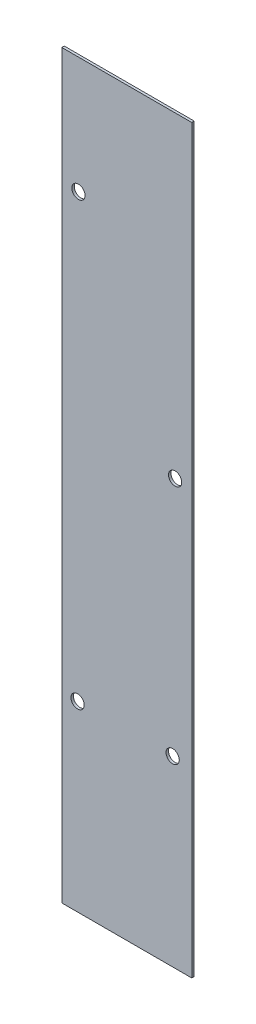
ISO-10303-21;
HEADER;
FILE_DESCRIPTION(('STEP AP214'),'2;1');
FILE_NAME('part.step','',(''),(''),'','','');
FILE_SCHEMA(('AUTOMOTIVE_DESIGN { 1 0 10303 214 1 1 1 1 }'));
ENDSEC;
DATA;
#1=APPLICATION_CONTEXT('core data for automotive mechanical design processes');
#2=APPLICATION_PROTOCOL_DEFINITION('international standard','automotive_design',2000,#1);
#3=PRODUCT_CONTEXT('',#1,'mechanical');
#4=PRODUCT('Part','Part','',(#3));
#5=PRODUCT_RELATED_PRODUCT_CATEGORY('part','',(#4));
#6=PRODUCT_DEFINITION_FORMATION('','',#4);
#7=PRODUCT_DEFINITION_CONTEXT('part definition',#1,'design');
#8=PRODUCT_DEFINITION('design','',#6,#7);
#9=PRODUCT_DEFINITION_SHAPE('','',#8);
#10=(LENGTH_UNIT() NAMED_UNIT(*) SI_UNIT(.MILLI.,.METRE.));
#11=(NAMED_UNIT(*) PLANE_ANGLE_UNIT() SI_UNIT($,.RADIAN.));
#12=(NAMED_UNIT(*) SI_UNIT($,.STERADIAN.) SOLID_ANGLE_UNIT());
#13=UNCERTAINTY_MEASURE_WITH_UNIT(LENGTH_MEASURE(1.E-05),#10,'distance_accuracy_value','');
#14=(GEOMETRIC_REPRESENTATION_CONTEXT(3) GLOBAL_UNCERTAINTY_ASSIGNED_CONTEXT((#13)) GLOBAL_UNIT_ASSIGNED_CONTEXT((#10,
#11,#12)) REPRESENTATION_CONTEXT('',''));
#15=CARTESIAN_POINT('',(0.,0.,0.));
#16=DIRECTION('',(0.,0.,1.));
#17=DIRECTION('',(1.,0.,0.));
#18=AXIS2_PLACEMENT_3D('',#15,#16,#17);
#19=CARTESIAN_POINT('',(0.,222.25,-0.736599999999997));
#20=DIRECTION('',(-1.,0.,0.));
#21=DIRECTION('',(0.,-1.,0.));
#22=AXIS2_PLACEMENT_3D('',#19,#20,#21);
#23=PLANE('',#22);
#24=DIRECTION('',(0.,-1.,0.));
#25=VECTOR('',#24,1.);
#26=CARTESIAN_POINT('',(0.,222.25,0.));
#27=LINE('',#26,#25);
#28=CARTESIAN_POINT('',(0.,222.25,0.));
#29=VERTEX_POINT('',#28);
#30=CARTESIAN_POINT('',(0.,0.,0.));
#31=VERTEX_POINT('',#30);
#32=EDGE_CURVE('E103',#29,#31,#27,.T.);
#33=ORIENTED_EDGE('',*,*,#32,.F.);
#34=DIRECTION('',(0.,0.,1.));
#35=VECTOR('',#34,1.);
#36=CARTESIAN_POINT('',(0.,222.25,-0.736599999999997));
#37=LINE('',#36,#35);
#38=CARTESIAN_POINT('',(0.,222.25,-0.736599999999997));
#39=VERTEX_POINT('',#38);
#40=EDGE_CURVE('E11',#39,#29,#37,.T.);
#41=ORIENTED_EDGE('',*,*,#40,.F.);
#42=DIRECTION('',(0.,-1.,0.));
#43=VECTOR('',#42,1.);
#44=CARTESIAN_POINT('',(0.,222.25,-0.736599999999997));
#45=LINE('',#44,#43);
#46=CARTESIAN_POINT('',(0.,0.,-0.736599999999997));
#47=VERTEX_POINT('',#46);
#48=EDGE_CURVE('E96',#39,#47,#45,.T.);
#49=ORIENTED_EDGE('',*,*,#48,.T.);
#50=DIRECTION('',(0.,0.,1.));
#51=VECTOR('',#50,1.);
#52=CARTESIAN_POINT('',(0.,0.,-0.736599999999997));
#53=LINE('',#52,#51);
#54=EDGE_CURVE('E41',#47,#31,#53,.T.);
#55=ORIENTED_EDGE('',*,*,#54,.T.);
#56=EDGE_LOOP('',(#33,#41,#49,#55));
#57=FACE_BOUND('',#56,.T.);
#58=ADVANCED_FACE('F38',(#57),#23,.T.);
#59=CARTESIAN_POINT('',(0.,222.25,-0.736599999999997));
#60=DIRECTION('',(0.,1.,0.));
#61=DIRECTION('',(0.,0.,1.));
#62=AXIS2_PLACEMENT_3D('',#59,#60,#61);
#63=PLANE('',#62);
#64=DIRECTION('',(-1.,0.,0.));
#65=VECTOR('',#64,1.);
#66=CARTESIAN_POINT('',(0.,222.25,0.));
#67=LINE('',#66,#65);
#68=CARTESIAN_POINT('',(39.,222.25,0.));
#69=VERTEX_POINT('',#68);
#70=EDGE_CURVE('E98',#69,#29,#67,.T.);
#71=ORIENTED_EDGE('',*,*,#70,.F.);
#72=DIRECTION('',(0.,0.,1.));
#73=VECTOR('',#72,1.);
#74=CARTESIAN_POINT('',(39.,222.25,-0.736599999999997));
#75=LINE('',#74,#73);
#76=CARTESIAN_POINT('',(39.,222.25,-0.736599999999997));
#77=VERTEX_POINT('',#76);
#78=EDGE_CURVE('E47',#77,#69,#75,.T.);
#79=ORIENTED_EDGE('',*,*,#78,.F.);
#80=DIRECTION('',(-1.,0.,0.));
#81=VECTOR('',#80,1.);
#82=CARTESIAN_POINT('',(0.,222.25,-0.736599999999997));
#83=LINE('',#82,#81);
#84=EDGE_CURVE('E93',#77,#39,#83,.T.);
#85=ORIENTED_EDGE('',*,*,#84,.T.);
#86=ORIENTED_EDGE('',*,*,#40,.T.);
#87=EDGE_LOOP('',(#71,#79,#85,#86));
#88=FACE_BOUND('',#87,.T.);
#89=ADVANCED_FACE('F114',(#88),#63,.T.);
#90=CARTESIAN_POINT('',(39.,222.25,-0.736599999999997));
#91=DIRECTION('',(1.,0.,0.));
#92=DIRECTION('',(0.,1.,0.));
#93=AXIS2_PLACEMENT_3D('',#90,#91,#92);
#94=PLANE('',#93);
#95=DIRECTION('',(0.,1.,0.));
#96=VECTOR('',#95,1.);
#97=CARTESIAN_POINT('',(39.,222.25,0.));
#98=LINE('',#97,#96);
#99=CARTESIAN_POINT('',(39.,0.,0.));
#100=VERTEX_POINT('',#99);
#101=EDGE_CURVE('E88',#100,#69,#98,.T.);
#102=ORIENTED_EDGE('',*,*,#101,.F.);
#103=DIRECTION('',(0.,0.,1.));
#104=VECTOR('',#103,1.);
#105=CARTESIAN_POINT('',(39.,0.,-0.736599999999997));
#106=LINE('',#105,#104);
#107=CARTESIAN_POINT('',(39.,0.,-0.736599999999997));
#108=VERTEX_POINT('',#107);
#109=EDGE_CURVE('E83',#108,#100,#106,.T.);
#110=ORIENTED_EDGE('',*,*,#109,.F.);
#111=DIRECTION('',(0.,1.,0.));
#112=VECTOR('',#111,1.);
#113=CARTESIAN_POINT('',(39.,222.25,-0.736599999999997));
#114=LINE('',#113,#112);
#115=EDGE_CURVE('E86',#108,#77,#114,.T.);
#116=ORIENTED_EDGE('',*,*,#115,.T.);
#117=ORIENTED_EDGE('',*,*,#78,.T.);
#118=EDGE_LOOP('',(#102,#110,#116,#117));
#119=FACE_BOUND('',#118,.T.);
#120=ADVANCED_FACE('F85',(#119),#94,.T.);
#121=CARTESIAN_POINT('',(0.,0.,-0.736599999999997));
#122=DIRECTION('',(0.,-1.,0.));
#123=DIRECTION('',(0.,0.,-1.));
#124=AXIS2_PLACEMENT_3D('',#121,#122,#123);
#125=PLANE('',#124);
#126=DIRECTION('',(1.,0.,0.));
#127=VECTOR('',#126,1.);
#128=CARTESIAN_POINT('',(0.,0.,0.));
#129=LINE('',#128,#127);
#130=EDGE_CURVE('E106',#31,#100,#129,.T.);
#131=ORIENTED_EDGE('',*,*,#130,.F.);
#132=ORIENTED_EDGE('',*,*,#54,.F.);
#133=DIRECTION('',(1.,0.,0.));
#134=VECTOR('',#133,1.);
#135=CARTESIAN_POINT('',(0.,0.,-0.736599999999997));
#136=LINE('',#135,#134);
#137=EDGE_CURVE('E92',#47,#108,#136,.T.);
#138=ORIENTED_EDGE('',*,*,#137,.T.);
#139=ORIENTED_EDGE('',*,*,#109,.T.);
#140=EDGE_LOOP('',(#131,#132,#138,#139));
#141=FACE_BOUND('',#140,.T.);
#142=ADVANCED_FACE('F95',(#141),#125,.T.);
#143=CARTESIAN_POINT('',(0.,0.,-0.736599999999997));
#144=DIRECTION('',(0.,0.,1.));
#145=DIRECTION('',(1.,0.,0.));
#146=AXIS2_PLACEMENT_3D('',#143,#144,#145);
#147=PLANE('',#146);
#148=CARTESIAN_POINT('',(33.2634,54.75,-0.736599999999997));
#149=DIRECTION('',(0.,0.,1.));
#150=DIRECTION('',(1.,0.,0.));
#151=AXIS2_PLACEMENT_3D('',#148,#149,#150);
#152=CIRCLE('',#151,1.98437499999999);
#153=CARTESIAN_POINT('',(35.247775,54.75,-0.736599999999997));
#154=VERTEX_POINT('',#153);
#155=EDGE_CURVE('E158',#154,#154,#152,.T.);
#156=ORIENTED_EDGE('',*,*,#155,.T.);
#157=EDGE_LOOP('',(#156));
#158=FACE_BOUND('',#157,.T.);
#159=CARTESIAN_POINT('',(4.73660000000002,54.75,-0.736600000000004));
#160=DIRECTION('',(0.,0.,1.));
#161=DIRECTION('',(1.,0.,0.));
#162=AXIS2_PLACEMENT_3D('',#159,#160,#161);
#163=CIRCLE('',#162,1.984375);
#164=CARTESIAN_POINT('',(6.72097500000002,54.75,-0.736600000000004));
#165=VERTEX_POINT('',#164);
#166=EDGE_CURVE('E162',#165,#165,#163,.T.);
#167=ORIENTED_EDGE('',*,*,#166,.T.);
#168=EDGE_LOOP('',(#167));
#169=FACE_BOUND('',#168,.T.);
#170=CARTESIAN_POINT('',(34.,127.25,-0.736599999999997));
#171=DIRECTION('',(0.,0.,1.));
#172=DIRECTION('',(1.,0.,0.));
#173=AXIS2_PLACEMENT_3D('',#170,#171,#172);
#174=CIRCLE('',#173,1.984375);
#175=CARTESIAN_POINT('',(35.984375,127.25,-0.736599999999997));
#176=VERTEX_POINT('',#175);
#177=EDGE_CURVE('E171',#176,#176,#174,.T.);
#178=ORIENTED_EDGE('',*,*,#177,.T.);
#179=EDGE_LOOP('',(#178));
#180=FACE_BOUND('',#179,.T.);
#181=CARTESIAN_POINT('',(4.99999999999999,187.25,-0.736600000000004));
#182=DIRECTION('',(0.,0.,1.));
#183=DIRECTION('',(1.,0.,0.));
#184=AXIS2_PLACEMENT_3D('',#181,#182,#183);
#185=CIRCLE('',#184,1.984375);
#186=CARTESIAN_POINT('',(6.98437499999999,187.25,-0.736600000000004));
#187=VERTEX_POINT('',#186);
#188=EDGE_CURVE('E107',#187,#187,#185,.T.);
#189=ORIENTED_EDGE('',*,*,#188,.T.);
#190=EDGE_LOOP('',(#189));
#191=FACE_BOUND('',#190,.T.);
#192=ORIENTED_EDGE('',*,*,#48,.F.);
#193=ORIENTED_EDGE('',*,*,#84,.F.);
#194=ORIENTED_EDGE('',*,*,#115,.F.);
#195=ORIENTED_EDGE('',*,*,#137,.F.);
#196=EDGE_LOOP('',(#192,#193,#194,#195));
#197=FACE_BOUND('',#196,.T.);
#198=ADVANCED_FACE('F91',(#158,#169,#180,#191,#197),#147,.F.);
#199=CARTESIAN_POINT('',(0.,0.,0.));
#200=DIRECTION('',(0.,0.,1.));
#201=DIRECTION('',(1.,0.,0.));
#202=AXIS2_PLACEMENT_3D('',#199,#200,#201);
#203=PLANE('',#202);
#204=CARTESIAN_POINT('',(33.2634,54.75,0.));
#205=DIRECTION('',(0.,0.,1.));
#206=DIRECTION('',(1.,0.,0.));
#207=AXIS2_PLACEMENT_3D('',#204,#205,#206);
#208=CIRCLE('',#207,1.98437499999999);
#209=CARTESIAN_POINT('',(35.247775,54.75,0.));
#210=VERTEX_POINT('',#209);
#211=EDGE_CURVE('E156',#210,#210,#208,.T.);
#212=ORIENTED_EDGE('',*,*,#211,.F.);
#213=EDGE_LOOP('',(#212));
#214=FACE_BOUND('',#213,.T.);
#215=CARTESIAN_POINT('',(4.73660000000002,54.75,0.));
#216=DIRECTION('',(0.,0.,1.));
#217=DIRECTION('',(1.,0.,0.));
#218=AXIS2_PLACEMENT_3D('',#215,#216,#217);
#219=CIRCLE('',#218,1.984375);
#220=CARTESIAN_POINT('',(6.72097500000002,54.75,0.));
#221=VERTEX_POINT('',#220);
#222=EDGE_CURVE('E159',#221,#221,#219,.T.);
#223=ORIENTED_EDGE('',*,*,#222,.F.);
#224=EDGE_LOOP('',(#223));
#225=FACE_BOUND('',#224,.T.);
#226=CARTESIAN_POINT('',(34.,127.25,0.));
#227=DIRECTION('',(0.,0.,1.));
#228=DIRECTION('',(1.,0.,0.));
#229=AXIS2_PLACEMENT_3D('',#226,#227,#228);
#230=CIRCLE('',#229,1.984375);
#231=CARTESIAN_POINT('',(35.984375,127.25,0.));
#232=VERTEX_POINT('',#231);
#233=EDGE_CURVE('E168',#232,#232,#230,.T.);
#234=ORIENTED_EDGE('',*,*,#233,.F.);
#235=EDGE_LOOP('',(#234));
#236=FACE_BOUND('',#235,.T.);
#237=CARTESIAN_POINT('',(4.99999999999999,187.25,0.));
#238=DIRECTION('',(0.,0.,1.));
#239=DIRECTION('',(1.,0.,0.));
#240=AXIS2_PLACEMENT_3D('',#237,#238,#239);
#241=CIRCLE('',#240,1.984375);
#242=CARTESIAN_POINT('',(6.98437499999999,187.25,0.));
#243=VERTEX_POINT('',#242);
#244=EDGE_CURVE('E174',#243,#243,#241,.T.);
#245=ORIENTED_EDGE('',*,*,#244,.F.);
#246=EDGE_LOOP('',(#245));
#247=FACE_BOUND('',#246,.T.);
#248=ORIENTED_EDGE('',*,*,#32,.T.);
#249=ORIENTED_EDGE('',*,*,#130,.T.);
#250=ORIENTED_EDGE('',*,*,#101,.T.);
#251=ORIENTED_EDGE('',*,*,#70,.T.);
#252=EDGE_LOOP('',(#248,#249,#250,#251));
#253=FACE_BOUND('',#252,.T.);
#254=ADVANCED_FACE('F113',(#214,#225,#236,#247,#253),#203,.T.);
#255=CARTESIAN_POINT('',(4.99999999999999,187.25,-10.));
#256=DIRECTION('',(0.,0.,1.));
#257=DIRECTION('',(1.,0.,0.));
#258=AXIS2_PLACEMENT_3D('',#255,#256,#257);
#259=CYLINDRICAL_SURFACE('',#258,1.984375);
#260=ORIENTED_EDGE('',*,*,#244,.T.);
#261=EDGE_LOOP('',(#260));
#262=FACE_BOUND('',#261,.T.);
#263=ORIENTED_EDGE('',*,*,#188,.F.);
#264=EDGE_LOOP('',(#263));
#265=FACE_BOUND('',#264,.T.);
#266=ADVANCED_FACE('F132',(#262,#265),#259,.F.);
#267=CARTESIAN_POINT('',(34.,127.25,-9.99999999999999));
#268=DIRECTION('',(0.,0.,1.));
#269=DIRECTION('',(1.,0.,0.));
#270=AXIS2_PLACEMENT_3D('',#267,#268,#269);
#271=CYLINDRICAL_SURFACE('',#270,1.984375);
#272=ORIENTED_EDGE('',*,*,#233,.T.);
#273=EDGE_LOOP('',(#272));
#274=FACE_BOUND('',#273,.T.);
#275=ORIENTED_EDGE('',*,*,#177,.F.);
#276=EDGE_LOOP('',(#275));
#277=FACE_BOUND('',#276,.T.);
#278=ADVANCED_FACE('F139',(#274,#277),#271,.F.);
#279=CARTESIAN_POINT('',(4.73660000000002,54.75,-10.));
#280=DIRECTION('',(0.,0.,1.));
#281=DIRECTION('',(1.,0.,0.));
#282=AXIS2_PLACEMENT_3D('',#279,#280,#281);
#283=CYLINDRICAL_SURFACE('',#282,1.984375);
#284=ORIENTED_EDGE('',*,*,#222,.T.);
#285=EDGE_LOOP('',(#284));
#286=FACE_BOUND('',#285,.T.);
#287=ORIENTED_EDGE('',*,*,#166,.F.);
#288=EDGE_LOOP('',(#287));
#289=FACE_BOUND('',#288,.T.);
#290=ADVANCED_FACE('F143',(#286,#289),#283,.F.);
#291=CARTESIAN_POINT('',(33.2634,54.75,-9.99999999999999));
#292=DIRECTION('',(0.,0.,1.));
#293=DIRECTION('',(1.,0.,0.));
#294=AXIS2_PLACEMENT_3D('',#291,#292,#293);
#295=CYLINDRICAL_SURFACE('',#294,1.98437499999999);
#296=ORIENTED_EDGE('',*,*,#211,.T.);
#297=EDGE_LOOP('',(#296));
#298=FACE_BOUND('',#297,.T.);
#299=ORIENTED_EDGE('',*,*,#155,.F.);
#300=EDGE_LOOP('',(#299));
#301=FACE_BOUND('',#300,.T.);
#302=ADVANCED_FACE('F147',(#298,#301),#295,.F.);
#303=CLOSED_SHELL('',(#58,#89,#120,#142,#198,#254,#266,#278,#290,#302));
#304=MANIFOLD_SOLID_BREP('B2',#303);
#305=ADVANCED_BREP_SHAPE_REPRESENTATION('',(#18,#304),#14);
#306=SHAPE_DEFINITION_REPRESENTATION(#9,#305);
ENDSEC;
END-ISO-10303-21;
